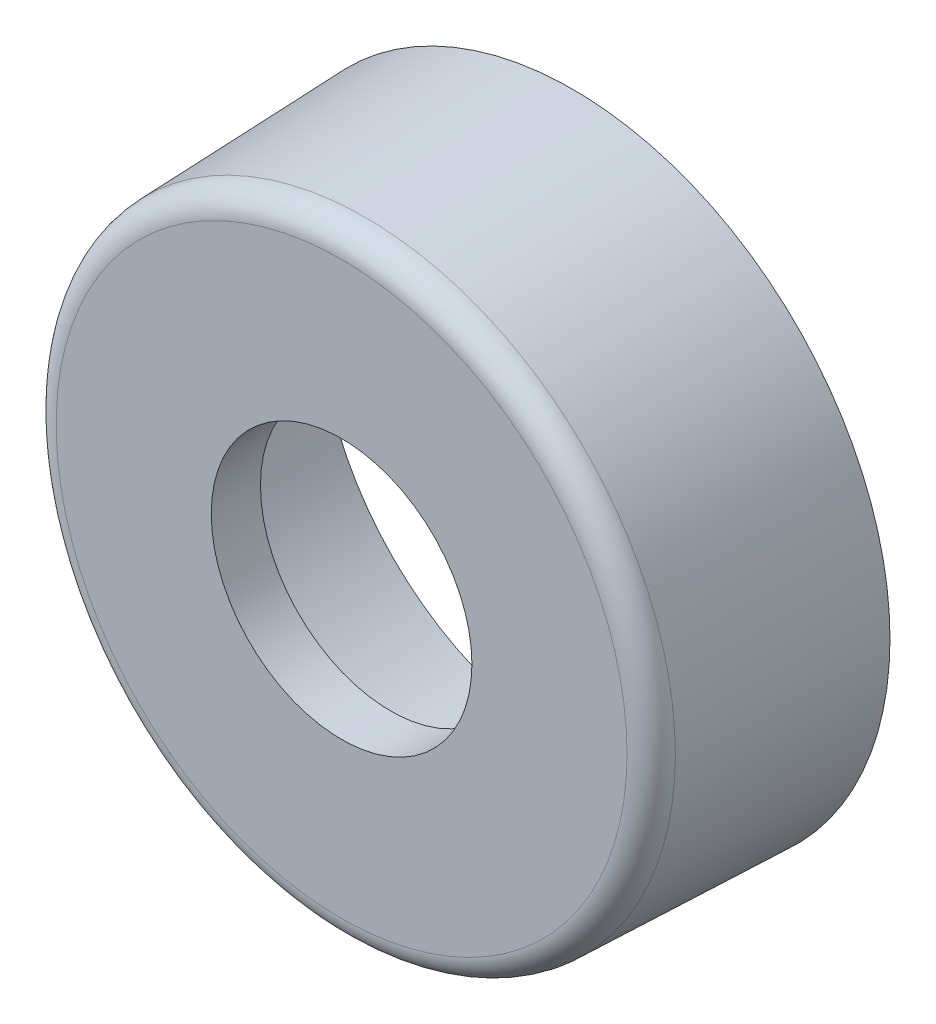
ISO-10303-21;
HEADER;
FILE_DESCRIPTION(('STEP AP214'),'2;1');
FILE_NAME('part.step','',(''),(''),'','','');
FILE_SCHEMA(('AUTOMOTIVE_DESIGN { 1 0 10303 214 1 1 1 1 }'));
ENDSEC;
DATA;
#1=APPLICATION_CONTEXT('core data for automotive mechanical design processes');
#2=APPLICATION_PROTOCOL_DEFINITION('international standard','automotive_design',2000,#1);
#3=PRODUCT_CONTEXT('',#1,'mechanical');
#4=PRODUCT('Part','Part','',(#3));
#5=PRODUCT_RELATED_PRODUCT_CATEGORY('part','',(#4));
#6=PRODUCT_DEFINITION_FORMATION('','',#4);
#7=PRODUCT_DEFINITION_CONTEXT('part definition',#1,'design');
#8=PRODUCT_DEFINITION('design','',#6,#7);
#9=PRODUCT_DEFINITION_SHAPE('','',#8);
#10=(LENGTH_UNIT() NAMED_UNIT(*) SI_UNIT(.MILLI.,.METRE.));
#11=(NAMED_UNIT(*) PLANE_ANGLE_UNIT() SI_UNIT($,.RADIAN.));
#12=(NAMED_UNIT(*) SI_UNIT($,.STERADIAN.) SOLID_ANGLE_UNIT());
#13=UNCERTAINTY_MEASURE_WITH_UNIT(LENGTH_MEASURE(1.E-05),#10,'distance_accuracy_value','');
#14=(GEOMETRIC_REPRESENTATION_CONTEXT(3) GLOBAL_UNCERTAINTY_ASSIGNED_CONTEXT((#13)) GLOBAL_UNIT_ASSIGNED_CONTEXT((#10,
#11,#12)) REPRESENTATION_CONTEXT('',''));
#15=CARTESIAN_POINT('',(0.,0.,0.));
#16=DIRECTION('',(0.,0.,1.));
#17=DIRECTION('',(1.,0.,0.));
#18=AXIS2_PLACEMENT_3D('',#15,#16,#17);
#19=CARTESIAN_POINT('',(0.,0.,0.));
#20=DIRECTION('',(0.,0.,1.));
#21=DIRECTION('',(1.,0.,0.));
#22=AXIS2_PLACEMENT_3D('',#19,#20,#21);
#23=CONICAL_SURFACE('',#22,5.15,0.0349065850398866);
#24=CARTESIAN_POINT('',(0.,0.,0.));
#25=DIRECTION('',(0.,0.,1.));
#26=DIRECTION('',(1.,0.,0.));
#27=AXIS2_PLACEMENT_3D('',#24,#25,#26);
#28=CIRCLE('',#27,5.15);
#29=CARTESIAN_POINT('',(5.15,0.,0.));
#30=VERTEX_POINT('',#29);
#31=EDGE_CURVE('E46',#30,#30,#28,.T.);
#32=ORIENTED_EDGE('',*,*,#31,.F.);
#33=EDGE_LOOP('',(#32));
#34=FACE_BOUND('',#33,.T.);
#35=CARTESIAN_POINT('',(0.,0.,3.7));
#36=DIRECTION('',(0.,0.,1.));
#37=DIRECTION('',(1.,0.,0.));
#38=AXIS2_PLACEMENT_3D('',#35,#36,#37);
#39=CIRCLE('',#38,5.27920684711947);
#40=CARTESIAN_POINT('',(5.27920684711947,0.,3.7));
#41=VERTEX_POINT('',#40);
#42=EDGE_CURVE('E49',#41,#41,#39,.T.);
#43=ORIENTED_EDGE('',*,*,#42,.T.);
#44=EDGE_LOOP('',(#43));
#45=FACE_BOUND('',#44,.T.);
#46=ADVANCED_FACE('F31',(#34,#45),#23,.F.);
#47=CARTESIAN_POINT('',(0.,0.,4.7));
#48=DIRECTION('',(0.,0.,1.));
#49=DIRECTION('',(1.,0.,0.));
#50=AXIS2_PLACEMENT_3D('',#47,#48,#49);
#51=PLANE('',#50);
#52=CARTESIAN_POINT('',(0.,0.,4.7));
#53=DIRECTION('',(0.,0.,1.));
#54=DIRECTION('',(1.,0.,0.));
#55=AXIS2_PLACEMENT_3D('',#52,#53,#54);
#56=CIRCLE('',#55,5.80302799598525);
#57=CARTESIAN_POINT('',(5.80302799598525,0.,4.7));
#58=VERTEX_POINT('',#57);
#59=EDGE_CURVE('E38',#58,#58,#56,.T.);
#60=ORIENTED_EDGE('',*,*,#59,.T.);
#61=EDGE_LOOP('',(#60));
#62=FACE_BOUND('',#61,.T.);
#63=CARTESIAN_POINT('',(0.,0.,4.7));
#64=DIRECTION('',(0.,0.,1.));
#65=DIRECTION('',(1.,0.,0.));
#66=AXIS2_PLACEMENT_3D('',#63,#64,#65);
#67=CIRCLE('',#66,2.65);
#68=CARTESIAN_POINT('',(2.65,0.,4.7));
#69=VERTEX_POINT('',#68);
#70=EDGE_CURVE('E55',#69,#69,#67,.T.);
#71=ORIENTED_EDGE('',*,*,#70,.F.);
#72=EDGE_LOOP('',(#71));
#73=FACE_BOUND('',#72,.T.);
#74=ADVANCED_FACE('F70',(#62,#73),#51,.T.);
#75=CARTESIAN_POINT('',(0.,0.,0.));
#76=DIRECTION('',(0.,0.,1.));
#77=DIRECTION('',(1.,0.,0.));
#78=AXIS2_PLACEMENT_3D('',#75,#76,#77);
#79=PLANE('',#78);
#80=CARTESIAN_POINT('',(0.,0.,0.));
#81=DIRECTION('',(0.,0.,1.));
#82=DIRECTION('',(1.,0.,0.));
#83=AXIS2_PLACEMENT_3D('',#80,#81,#82);
#84=CIRCLE('',#83,6.45);
#85=CARTESIAN_POINT('',(6.45,0.,0.));
#86=VERTEX_POINT('',#85);
#87=EDGE_CURVE('E42',#86,#86,#84,.T.);
#88=ORIENTED_EDGE('',*,*,#87,.F.);
#89=EDGE_LOOP('',(#88));
#90=FACE_BOUND('',#89,.T.);
#91=ORIENTED_EDGE('',*,*,#31,.T.);
#92=EDGE_LOOP('',(#91));
#93=FACE_BOUND('',#92,.T.);
#94=ADVANCED_FACE('F72',(#90,#93),#79,.F.);
#95=CARTESIAN_POINT('',(0.,0.,0.));
#96=DIRECTION('',(0.,0.,-1.));
#97=DIRECTION('',(1.,0.,0.));
#98=AXIS2_PLACEMENT_3D('',#95,#96,#97);
#99=CONICAL_SURFACE('',#98,6.45,0.0349065850398866);
#100=CARTESIAN_POINT('',(0.,0.,4.21744974835125));
#101=DIRECTION('',(0.,0.,-1.));
#102=DIRECTION('',(-1.,0.,0.));
#103=AXIS2_PLACEMENT_3D('',#100,#101,#102);
#104=CIRCLE('',#103,6.3027234094948);
#105=CARTESIAN_POINT('',(-6.3027234094948,0.,4.21744974835125));
#106=VERTEX_POINT('',#105);
#107=EDGE_CURVE('E10',#106,#106,#104,.T.);
#108=ORIENTED_EDGE('',*,*,#107,.T.);
#109=EDGE_LOOP('',(#108));
#110=FACE_BOUND('',#109,.T.);
#111=ORIENTED_EDGE('',*,*,#87,.T.);
#112=EDGE_LOOP('',(#111));
#113=FACE_BOUND('',#112,.T.);
#114=ADVANCED_FACE('F78',(#110,#113),#99,.T.);
#115=CARTESIAN_POINT('',(0.,0.,3.7));
#116=DIRECTION('',(0.,0.,1.));
#117=DIRECTION('',(1.,0.,0.));
#118=AXIS2_PLACEMENT_3D('',#115,#116,#117);
#119=PLANE('',#118);
#120=CARTESIAN_POINT('',(0.,0.,3.7));
#121=DIRECTION('',(0.,0.,1.));
#122=DIRECTION('',(1.,0.,0.));
#123=AXIS2_PLACEMENT_3D('',#120,#121,#122);
#124=CIRCLE('',#123,2.65);
#125=CARTESIAN_POINT('',(2.65,0.,3.7));
#126=VERTEX_POINT('',#125);
#127=EDGE_CURVE('E51',#126,#126,#124,.T.);
#128=ORIENTED_EDGE('',*,*,#127,.T.);
#129=EDGE_LOOP('',(#128));
#130=FACE_BOUND('',#129,.T.);
#131=ORIENTED_EDGE('',*,*,#42,.F.);
#132=EDGE_LOOP('',(#131));
#133=FACE_BOUND('',#132,.T.);
#134=ADVANCED_FACE('F61',(#130,#133),#119,.F.);
#135=CARTESIAN_POINT('',(0.,0.,3.7));
#136=DIRECTION('',(0.,0.,1.));
#137=DIRECTION('',(1.,0.,0.));
#138=AXIS2_PLACEMENT_3D('',#135,#136,#137);
#139=CYLINDRICAL_SURFACE('',#138,2.65);
#140=ORIENTED_EDGE('',*,*,#127,.F.);
#141=EDGE_LOOP('',(#140));
#142=FACE_BOUND('',#141,.T.);
#143=ORIENTED_EDGE('',*,*,#70,.T.);
#144=EDGE_LOOP('',(#143));
#145=FACE_BOUND('',#144,.T.);
#146=ADVANCED_FACE('F64',(#142,#145),#139,.F.);
#147=CARTESIAN_POINT('',(0.,0.,4.2));
#148=DIRECTION('',(0.,0.,1.));
#149=DIRECTION('',(1.,0.,0.));
#150=AXIS2_PLACEMENT_3D('',#147,#148,#149);
#151=TOROIDAL_SURFACE('',#150,5.80302799598525,0.5);
#152=ORIENTED_EDGE('',*,*,#107,.F.);
#153=EDGE_LOOP('',(#152));
#154=FACE_BOUND('',#153,.T.);
#155=ORIENTED_EDGE('',*,*,#59,.F.);
#156=EDGE_LOOP('',(#155));
#157=FACE_BOUND('',#156,.T.);
#158=ADVANCED_FACE('F33',(#154,#157),#151,.T.);
#159=CLOSED_SHELL('',(#46,#74,#94,#114,#134,#146,#158));
#160=MANIFOLD_SOLID_BREP('B2',#159);
#161=ADVANCED_BREP_SHAPE_REPRESENTATION('',(#18,#160),#14);
#162=SHAPE_DEFINITION_REPRESENTATION(#9,#161);
ENDSEC;
END-ISO-10303-21;
